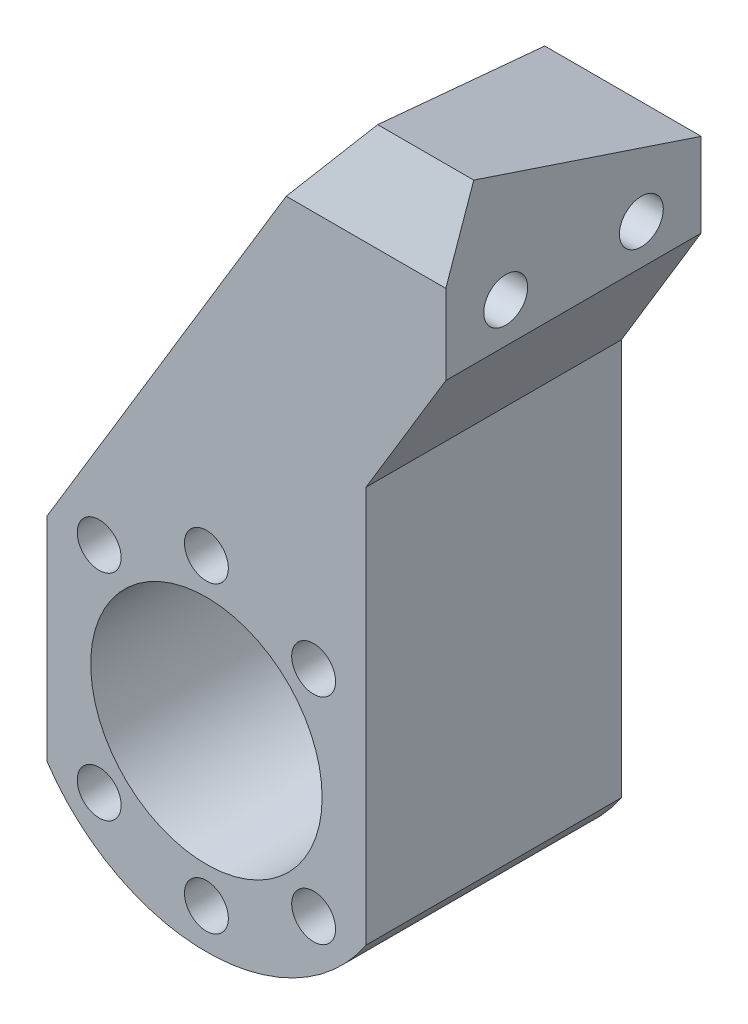
ISO-10303-21;
HEADER;
FILE_DESCRIPTION(('STEP AP214'),'2;1');
FILE_NAME('part.step','',(''),(''),'','','');
FILE_SCHEMA(('AUTOMOTIVE_DESIGN { 1 0 10303 214 1 1 1 1 }'));
ENDSEC;
DATA;
#1=APPLICATION_CONTEXT('core data for automotive mechanical design processes');
#2=APPLICATION_PROTOCOL_DEFINITION('international standard','automotive_design',2000,#1);
#3=PRODUCT_CONTEXT('',#1,'mechanical');
#4=PRODUCT('Part','Part','',(#3));
#5=PRODUCT_RELATED_PRODUCT_CATEGORY('part','',(#4));
#6=PRODUCT_DEFINITION_FORMATION('','',#4);
#7=PRODUCT_DEFINITION_CONTEXT('part definition',#1,'design');
#8=PRODUCT_DEFINITION('design','',#6,#7);
#9=PRODUCT_DEFINITION_SHAPE('','',#8);
#10=(LENGTH_UNIT() NAMED_UNIT(*) SI_UNIT(.MILLI.,.METRE.));
#11=(NAMED_UNIT(*) PLANE_ANGLE_UNIT() SI_UNIT($,.RADIAN.));
#12=(NAMED_UNIT(*) SI_UNIT($,.STERADIAN.) SOLID_ANGLE_UNIT());
#13=UNCERTAINTY_MEASURE_WITH_UNIT(LENGTH_MEASURE(1.E-05),#10,'distance_accuracy_value','');
#14=(GEOMETRIC_REPRESENTATION_CONTEXT(3) GLOBAL_UNCERTAINTY_ASSIGNED_CONTEXT((#13)) GLOBAL_UNIT_ASSIGNED_CONTEXT((#10,
#11,#12)) REPRESENTATION_CONTEXT('',''));
#15=CARTESIAN_POINT('',(0.,0.,0.));
#16=DIRECTION('',(0.,0.,1.));
#17=DIRECTION('',(1.,0.,0.));
#18=AXIS2_PLACEMENT_3D('',#15,#16,#17);
#19=CARTESIAN_POINT('',(0.,0.,32.));
#20=DIRECTION('',(0.,0.,-1.));
#21=DIRECTION('',(-1.,0.,0.));
#22=AXIS2_PLACEMENT_3D('',#19,#20,#21);
#23=PLANE('',#22);
#24=DIRECTION('',(0.,1.,0.));
#25=VECTOR('',#24,1.);
#26=CARTESIAN_POINT('',(20.,13.2664991614216,32.));
#27=LINE('',#26,#25);
#28=CARTESIAN_POINT('',(20.,-13.2664991614216,32.));
#29=VERTEX_POINT('',#28);
#30=CARTESIAN_POINT('',(20.,36.4228304347549,32.));
#31=VERTEX_POINT('',#30);
#32=EDGE_CURVE('E251',#29,#31,#27,.T.);
#33=ORIENTED_EDGE('',*,*,#32,.T.);
#34=DIRECTION('',(0.516511027740023,0.856280537103902,0.));
#35=VECTOR('',#34,1.);
#36=CARTESIAN_POINT('',(20.,36.4228304347549,32.));
#37=LINE('',#36,#35);
#38=CARTESIAN_POINT('',(30.,53.0009960714216,32.));
#39=VERTEX_POINT('',#38);
#40=EDGE_CURVE('E160',#31,#39,#37,.T.);
#41=ORIENTED_EDGE('',*,*,#40,.T.);
#42=DIRECTION('',(0.,1.,0.));
#43=VECTOR('',#42,1.);
#44=CARTESIAN_POINT('',(30.,63.0009960714216,32.));
#45=LINE('',#44,#43);
#46=CARTESIAN_POINT('',(30.,63.0009960714216,32.));
#47=VERTEX_POINT('',#46);
#48=EDGE_CURVE('E163',#39,#47,#45,.T.);
#49=ORIENTED_EDGE('',*,*,#48,.T.);
#50=DIRECTION('',(-1.,0.,0.));
#51=VECTOR('',#50,1.);
#52=CARTESIAN_POINT('',(10.,63.0009960714216,32.));
#53=LINE('',#52,#51);
#54=CARTESIAN_POINT('',(10.,63.0009960714216,32.));
#55=VERTEX_POINT('',#54);
#56=EDGE_CURVE('E152',#47,#55,#53,.T.);
#57=ORIENTED_EDGE('',*,*,#56,.T.);
#58=DIRECTION('',(-0.516511027740022,-0.856280537103901,0.));
#59=VECTOR('',#58,1.);
#60=CARTESIAN_POINT('',(10.,63.0009960714216,32.));
#61=LINE('',#60,#59);
#62=CARTESIAN_POINT('',(-20.,13.2664991614216,32.));
#63=VERTEX_POINT('',#62);
#64=EDGE_CURVE('E162',#55,#63,#61,.T.);
#65=ORIENTED_EDGE('',*,*,#64,.T.);
#66=DIRECTION('',(0.,-1.,0.));
#67=VECTOR('',#66,1.);
#68=CARTESIAN_POINT('',(-20.,13.2664991614216,32.));
#69=LINE('',#68,#67);
#70=CARTESIAN_POINT('',(-20.,-13.2664991614216,32.));
#71=VERTEX_POINT('',#70);
#72=EDGE_CURVE('E254',#63,#71,#69,.T.);
#73=ORIENTED_EDGE('',*,*,#72,.T.);
#74=CARTESIAN_POINT('',(0.,0.,32.));
#75=DIRECTION('',(0.,0.,1.));
#76=DIRECTION('',(1.,0.,0.));
#77=AXIS2_PLACEMENT_3D('',#74,#75,#76);
#78=CIRCLE('',#77,24.);
#79=EDGE_CURVE('E256',#71,#29,#78,.T.);
#80=ORIENTED_EDGE('',*,*,#79,.T.);
#81=EDGE_LOOP('',(#33,#41,#49,#57,#65,#73,#80));
#82=FACE_BOUND('',#81,.T.);
#83=CARTESIAN_POINT('',(0.,0.,32.));
#84=DIRECTION('',(0.,0.,1.));
#85=DIRECTION('',(1.,0.,0.));
#86=AXIS2_PLACEMENT_3D('',#83,#84,#85);
#87=CIRCLE('',#86,14.5);
#88=CARTESIAN_POINT('',(14.5,0.,32.));
#89=VERTEX_POINT('',#88);
#90=EDGE_CURVE('E260',#89,#89,#87,.T.);
#91=ORIENTED_EDGE('',*,*,#90,.F.);
#92=EDGE_LOOP('',(#91));
#93=FACE_BOUND('',#92,.T.);
#94=CARTESIAN_POINT('',(0.,19.,32.));
#95=DIRECTION('',(0.,0.,1.));
#96=DIRECTION('',(1.,0.,0.));
#97=AXIS2_PLACEMENT_3D('',#94,#95,#96);
#98=CIRCLE('',#97,2.75);
#99=CARTESIAN_POINT('',(2.75,19.,32.));
#100=VERTEX_POINT('',#99);
#101=EDGE_CURVE('E266',#100,#100,#98,.T.);
#102=ORIENTED_EDGE('',*,*,#101,.F.);
#103=EDGE_LOOP('',(#102));
#104=FACE_BOUND('',#103,.T.);
#105=CARTESIAN_POINT('',(-13.4350288425444,13.4350288425444,32.));
#106=DIRECTION('',(0.,0.,1.));
#107=DIRECTION('',(1.,0.,0.));
#108=AXIS2_PLACEMENT_3D('',#105,#106,#107);
#109=CIRCLE('',#108,2.75);
#110=CARTESIAN_POINT('',(-10.6850288425444,13.4350288425444,32.));
#111=VERTEX_POINT('',#110);
#112=EDGE_CURVE('E272',#111,#111,#109,.T.);
#113=ORIENTED_EDGE('',*,*,#112,.F.);
#114=EDGE_LOOP('',(#113));
#115=FACE_BOUND('',#114,.T.);
#116=CARTESIAN_POINT('',(13.4350288425444,13.4350288425444,32.));
#117=DIRECTION('',(0.,0.,1.));
#118=DIRECTION('',(1.,0.,0.));
#119=AXIS2_PLACEMENT_3D('',#116,#117,#118);
#120=CIRCLE('',#119,2.75);
#121=CARTESIAN_POINT('',(16.1850288425444,13.4350288425444,32.));
#122=VERTEX_POINT('',#121);
#123=EDGE_CURVE('E278',#122,#122,#120,.T.);
#124=ORIENTED_EDGE('',*,*,#123,.F.);
#125=EDGE_LOOP('',(#124));
#126=FACE_BOUND('',#125,.T.);
#127=CARTESIAN_POINT('',(0.,-19.,32.));
#128=DIRECTION('',(0.,0.,1.));
#129=DIRECTION('',(1.,0.,0.));
#130=AXIS2_PLACEMENT_3D('',#127,#128,#129);
#131=CIRCLE('',#130,2.75);
#132=CARTESIAN_POINT('',(2.75,-19.,32.));
#133=VERTEX_POINT('',#132);
#134=EDGE_CURVE('E284',#133,#133,#131,.T.);
#135=ORIENTED_EDGE('',*,*,#134,.F.);
#136=EDGE_LOOP('',(#135));
#137=FACE_BOUND('',#136,.T.);
#138=CARTESIAN_POINT('',(13.4350288425444,-13.4350288425444,32.));
#139=DIRECTION('',(0.,0.,1.));
#140=DIRECTION('',(1.,0.,0.));
#141=AXIS2_PLACEMENT_3D('',#138,#139,#140);
#142=CIRCLE('',#141,2.75);
#143=CARTESIAN_POINT('',(16.1850288425444,-13.4350288425444,32.));
#144=VERTEX_POINT('',#143);
#145=EDGE_CURVE('E290',#144,#144,#142,.T.);
#146=ORIENTED_EDGE('',*,*,#145,.F.);
#147=EDGE_LOOP('',(#146));
#148=FACE_BOUND('',#147,.T.);
#149=CARTESIAN_POINT('',(-13.4350288425444,-13.4350288425444,32.));
#150=DIRECTION('',(0.,0.,1.));
#151=DIRECTION('',(1.,0.,0.));
#152=AXIS2_PLACEMENT_3D('',#149,#150,#151);
#153=CIRCLE('',#152,2.75);
#154=CARTESIAN_POINT('',(-10.6850288425444,-13.4350288425444,32.));
#155=VERTEX_POINT('',#154);
#156=EDGE_CURVE('E296',#155,#155,#153,.T.);
#157=ORIENTED_EDGE('',*,*,#156,.F.);
#158=EDGE_LOOP('',(#157));
#159=FACE_BOUND('',#158,.T.);
#160=ADVANCED_FACE('F36',(#82,#93,#104,#115,#126,#137,#148,#159),#23,.F.);
#161=CARTESIAN_POINT('',(0.,0.,0.));
#162=DIRECTION('',(0.,0.,-1.));
#163=DIRECTION('',(-1.,0.,0.));
#164=AXIS2_PLACEMENT_3D('',#161,#162,#163);
#165=PLANE('',#164);
#166=DIRECTION('',(-0.622917300632838,-0.782287694248285,0.));
#167=VECTOR('',#166,1.);
#168=CARTESIAN_POINT('',(10.,63.0009960714216,0.));
#169=LINE('',#168,#167);
#170=CARTESIAN_POINT('',(10.3981382458223,63.5009960714216,0.));
#171=VERTEX_POINT('',#170);
#172=CARTESIAN_POINT('',(10.,63.0009960714216,0.));
#173=VERTEX_POINT('',#172);
#174=EDGE_CURVE('E132',#171,#173,#169,.T.);
#175=ORIENTED_EDGE('',*,*,#174,.F.);
#176=DIRECTION('',(1.,0.,0.));
#177=VECTOR('',#176,1.);
#178=CARTESIAN_POINT('',(10.,63.5009960714216,0.));
#179=LINE('',#178,#177);
#180=CARTESIAN_POINT('',(30.,63.5009960714216,0.));
#181=VERTEX_POINT('',#180);
#182=EDGE_CURVE('E174',#171,#181,#179,.T.);
#183=ORIENTED_EDGE('',*,*,#182,.T.);
#184=DIRECTION('',(0.,-1.,0.));
#185=VECTOR('',#184,1.);
#186=CARTESIAN_POINT('',(30.,63.0009960714216,0.));
#187=LINE('',#186,#185);
#188=CARTESIAN_POINT('',(30.,53.0009960714216,0.));
#189=VERTEX_POINT('',#188);
#190=EDGE_CURVE('E138',#181,#189,#187,.T.);
#191=ORIENTED_EDGE('',*,*,#190,.T.);
#192=DIRECTION('',(-0.516511027740022,-0.856280537103901,0.));
#193=VECTOR('',#192,1.);
#194=CARTESIAN_POINT('',(20.,36.4228304347549,0.));
#195=LINE('',#194,#193);
#196=CARTESIAN_POINT('',(20.,36.4228304347549,0.));
#197=VERTEX_POINT('',#196);
#198=EDGE_CURVE('E134',#189,#197,#195,.T.);
#199=ORIENTED_EDGE('',*,*,#198,.T.);
#200=DIRECTION('',(0.,1.,0.));
#201=VECTOR('',#200,1.);
#202=CARTESIAN_POINT('',(20.,13.2664991614216,0.));
#203=LINE('',#202,#201);
#204=CARTESIAN_POINT('',(20.,-13.2664991614216,0.));
#205=VERTEX_POINT('',#204);
#206=EDGE_CURVE('E247',#205,#197,#203,.T.);
#207=ORIENTED_EDGE('',*,*,#206,.F.);
#208=CARTESIAN_POINT('',(0.,0.,0.));
#209=DIRECTION('',(0.,0.,1.));
#210=DIRECTION('',(1.,0.,0.));
#211=AXIS2_PLACEMENT_3D('',#208,#209,#210);
#212=CIRCLE('',#211,24.);
#213=CARTESIAN_POINT('',(-20.,-13.2664991614216,0.));
#214=VERTEX_POINT('',#213);
#215=EDGE_CURVE('E240',#214,#205,#212,.T.);
#216=ORIENTED_EDGE('',*,*,#215,.F.);
#217=DIRECTION('',(0.,-1.,0.));
#218=VECTOR('',#217,1.);
#219=CARTESIAN_POINT('',(-20.,13.2664991614216,0.));
#220=LINE('',#219,#218);
#221=CARTESIAN_POINT('',(-20.,13.2664991614216,0.));
#222=VERTEX_POINT('',#221);
#223=EDGE_CURVE('E248',#222,#214,#220,.T.);
#224=ORIENTED_EDGE('',*,*,#223,.F.);
#225=DIRECTION('',(0.516511027740022,0.856280537103902,0.));
#226=VECTOR('',#225,1.);
#227=CARTESIAN_POINT('',(10.,63.0009960714216,0.));
#228=LINE('',#227,#226);
#229=EDGE_CURVE('E157',#222,#173,#228,.T.);
#230=ORIENTED_EDGE('',*,*,#229,.T.);
#231=EDGE_LOOP('',(#175,#183,#191,#199,#207,#216,#224,#230));
#232=FACE_BOUND('',#231,.T.);
#233=CARTESIAN_POINT('',(13.4350288425444,-13.4350288425444,0.));
#234=DIRECTION('',(0.,0.,1.));
#235=DIRECTION('',(1.,0.,0.));
#236=AXIS2_PLACEMENT_3D('',#233,#234,#235);
#237=CIRCLE('',#236,2.75);
#238=CARTESIAN_POINT('',(16.1850288425444,-13.4350288425444,0.));
#239=VERTEX_POINT('',#238);
#240=EDGE_CURVE('E293',#239,#239,#237,.T.);
#241=ORIENTED_EDGE('',*,*,#240,.T.);
#242=EDGE_LOOP('',(#241));
#243=FACE_BOUND('',#242,.T.);
#244=CARTESIAN_POINT('',(13.4350288425444,13.4350288425444,0.));
#245=DIRECTION('',(0.,0.,1.));
#246=DIRECTION('',(1.,0.,0.));
#247=AXIS2_PLACEMENT_3D('',#244,#245,#246);
#248=CIRCLE('',#247,2.75);
#249=CARTESIAN_POINT('',(16.1850288425444,13.4350288425444,0.));
#250=VERTEX_POINT('',#249);
#251=EDGE_CURVE('E281',#250,#250,#248,.T.);
#252=ORIENTED_EDGE('',*,*,#251,.T.);
#253=EDGE_LOOP('',(#252));
#254=FACE_BOUND('',#253,.T.);
#255=CARTESIAN_POINT('',(0.,19.,0.));
#256=DIRECTION('',(0.,0.,1.));
#257=DIRECTION('',(1.,0.,0.));
#258=AXIS2_PLACEMENT_3D('',#255,#256,#257);
#259=CIRCLE('',#258,2.75);
#260=CARTESIAN_POINT('',(2.75,19.,0.));
#261=VERTEX_POINT('',#260);
#262=EDGE_CURVE('E269',#261,#261,#259,.T.);
#263=ORIENTED_EDGE('',*,*,#262,.T.);
#264=EDGE_LOOP('',(#263));
#265=FACE_BOUND('',#264,.T.);
#266=CARTESIAN_POINT('',(0.,0.,0.));
#267=DIRECTION('',(0.,0.,1.));
#268=DIRECTION('',(1.,0.,0.));
#269=AXIS2_PLACEMENT_3D('',#266,#267,#268);
#270=CIRCLE('',#269,14.5);
#271=CARTESIAN_POINT('',(14.5,0.,0.));
#272=VERTEX_POINT('',#271);
#273=EDGE_CURVE('E263',#272,#272,#270,.T.);
#274=ORIENTED_EDGE('',*,*,#273,.T.);
#275=EDGE_LOOP('',(#274));
#276=FACE_BOUND('',#275,.T.);
#277=CARTESIAN_POINT('',(-13.4350288425444,13.4350288425444,0.));
#278=DIRECTION('',(0.,0.,1.));
#279=DIRECTION('',(1.,0.,0.));
#280=AXIS2_PLACEMENT_3D('',#277,#278,#279);
#281=CIRCLE('',#280,2.75);
#282=CARTESIAN_POINT('',(-10.6850288425444,13.4350288425444,0.));
#283=VERTEX_POINT('',#282);
#284=EDGE_CURVE('E275',#283,#283,#281,.T.);
#285=ORIENTED_EDGE('',*,*,#284,.T.);
#286=EDGE_LOOP('',(#285));
#287=FACE_BOUND('',#286,.T.);
#288=CARTESIAN_POINT('',(0.,-19.,0.));
#289=DIRECTION('',(0.,0.,1.));
#290=DIRECTION('',(1.,0.,0.));
#291=AXIS2_PLACEMENT_3D('',#288,#289,#290);
#292=CIRCLE('',#291,2.75);
#293=CARTESIAN_POINT('',(2.75,-19.,0.));
#294=VERTEX_POINT('',#293);
#295=EDGE_CURVE('E287',#294,#294,#292,.T.);
#296=ORIENTED_EDGE('',*,*,#295,.T.);
#297=EDGE_LOOP('',(#296));
#298=FACE_BOUND('',#297,.T.);
#299=CARTESIAN_POINT('',(-13.4350288425444,-13.4350288425444,0.));
#300=DIRECTION('',(0.,0.,1.));
#301=DIRECTION('',(1.,0.,0.));
#302=AXIS2_PLACEMENT_3D('',#299,#300,#301);
#303=CIRCLE('',#302,2.75);
#304=CARTESIAN_POINT('',(-10.6850288425444,-13.4350288425444,0.));
#305=VERTEX_POINT('',#304);
#306=EDGE_CURVE('E299',#305,#305,#303,.T.);
#307=ORIENTED_EDGE('',*,*,#306,.T.);
#308=EDGE_LOOP('',(#307));
#309=FACE_BOUND('',#308,.T.);
#310=ADVANCED_FACE('F214',(#232,#243,#254,#265,#276,#287,#298,#309),#165,.T.);
#311=CARTESIAN_POINT('',(-20.,13.2664991614216,32.));
#312=DIRECTION('',(1.,0.,0.));
#313=DIRECTION('',(0.,0.,-1.));
#314=AXIS2_PLACEMENT_3D('',#311,#312,#313);
#315=PLANE('',#314);
#316=ORIENTED_EDGE('',*,*,#223,.T.);
#317=DIRECTION('',(0.,0.,-1.));
#318=VECTOR('',#317,1.);
#319=CARTESIAN_POINT('',(-20.,-13.2664991614216,32.));
#320=LINE('',#319,#318);
#321=EDGE_CURVE('E44',#71,#214,#320,.T.);
#322=ORIENTED_EDGE('',*,*,#321,.F.);
#323=ORIENTED_EDGE('',*,*,#72,.F.);
#324=DIRECTION('',(0.,0.,-1.));
#325=VECTOR('',#324,1.);
#326=CARTESIAN_POINT('',(-20.,13.2664991614216,32.));
#327=LINE('',#326,#325);
#328=EDGE_CURVE('E11',#63,#222,#327,.T.);
#329=ORIENTED_EDGE('',*,*,#328,.T.);
#330=EDGE_LOOP('',(#316,#322,#323,#329));
#331=FACE_BOUND('',#330,.T.);
#332=ADVANCED_FACE('F38',(#331),#315,.F.);
#333=CARTESIAN_POINT('',(0.,0.,32.));
#334=DIRECTION('',(0.,0.,-1.));
#335=DIRECTION('',(-1.,0.,0.));
#336=AXIS2_PLACEMENT_3D('',#333,#334,#335);
#337=CYLINDRICAL_SURFACE('',#336,24.);
#338=ORIENTED_EDGE('',*,*,#215,.T.);
#339=DIRECTION('',(0.,0.,-1.));
#340=VECTOR('',#339,1.);
#341=CARTESIAN_POINT('',(20.,-13.2664991614216,32.));
#342=LINE('',#341,#340);
#343=EDGE_CURVE('E243',#29,#205,#342,.T.);
#344=ORIENTED_EDGE('',*,*,#343,.F.);
#345=ORIENTED_EDGE('',*,*,#79,.F.);
#346=ORIENTED_EDGE('',*,*,#321,.T.);
#347=EDGE_LOOP('',(#338,#344,#345,#346));
#348=FACE_BOUND('',#347,.T.);
#349=ADVANCED_FACE('F229',(#348),#337,.T.);
#350=CARTESIAN_POINT('',(20.,13.2664991614216,32.));
#351=DIRECTION('',(-1.,0.,0.));
#352=DIRECTION('',(0.,0.,1.));
#353=AXIS2_PLACEMENT_3D('',#350,#351,#352);
#354=PLANE('',#353);
#355=ORIENTED_EDGE('',*,*,#206,.T.);
#356=DIRECTION('',(0.,0.,-1.));
#357=VECTOR('',#356,1.);
#358=CARTESIAN_POINT('',(20.,36.4228304347549,102.523188972783));
#359=LINE('',#358,#357);
#360=EDGE_CURVE('E145',#31,#197,#359,.T.);
#361=ORIENTED_EDGE('',*,*,#360,.F.);
#362=ORIENTED_EDGE('',*,*,#32,.F.);
#363=ORIENTED_EDGE('',*,*,#343,.T.);
#364=EDGE_LOOP('',(#355,#361,#362,#363));
#365=FACE_BOUND('',#364,.T.);
#366=ADVANCED_FACE('F227',(#365),#354,.F.);
#367=CARTESIAN_POINT('',(0.,0.,32.));
#368=DIRECTION('',(0.,0.,-1.));
#369=DIRECTION('',(-1.,0.,0.));
#370=AXIS2_PLACEMENT_3D('',#367,#368,#369);
#371=CYLINDRICAL_SURFACE('',#370,14.5);
#372=ORIENTED_EDGE('',*,*,#90,.T.);
#373=EDGE_LOOP('',(#372));
#374=FACE_BOUND('',#373,.T.);
#375=ORIENTED_EDGE('',*,*,#273,.F.);
#376=EDGE_LOOP('',(#375));
#377=FACE_BOUND('',#376,.T.);
#378=ADVANCED_FACE('F224',(#374,#377),#371,.F.);
#379=CARTESIAN_POINT('',(0.,19.,32.));
#380=DIRECTION('',(0.,0.,-1.));
#381=DIRECTION('',(-1.,0.,0.));
#382=AXIS2_PLACEMENT_3D('',#379,#380,#381);
#383=CYLINDRICAL_SURFACE('',#382,2.75);
#384=ORIENTED_EDGE('',*,*,#101,.T.);
#385=EDGE_LOOP('',(#384));
#386=FACE_BOUND('',#385,.T.);
#387=ORIENTED_EDGE('',*,*,#262,.F.);
#388=EDGE_LOOP('',(#387));
#389=FACE_BOUND('',#388,.T.);
#390=ADVANCED_FACE('F368',(#386,#389),#383,.F.);
#391=CARTESIAN_POINT('',(-13.4350288425444,13.4350288425444,32.));
#392=DIRECTION('',(0.,0.,-1.));
#393=DIRECTION('',(-1.,0.,0.));
#394=AXIS2_PLACEMENT_3D('',#391,#392,#393);
#395=CYLINDRICAL_SURFACE('',#394,2.75);
#396=ORIENTED_EDGE('',*,*,#112,.T.);
#397=EDGE_LOOP('',(#396));
#398=FACE_BOUND('',#397,.T.);
#399=ORIENTED_EDGE('',*,*,#284,.F.);
#400=EDGE_LOOP('',(#399));
#401=FACE_BOUND('',#400,.T.);
#402=ADVANCED_FACE('F365',(#398,#401),#395,.F.);
#403=CARTESIAN_POINT('',(13.4350288425444,13.4350288425444,32.));
#404=DIRECTION('',(0.,0.,-1.));
#405=DIRECTION('',(-1.,0.,0.));
#406=AXIS2_PLACEMENT_3D('',#403,#404,#405);
#407=CYLINDRICAL_SURFACE('',#406,2.75);
#408=ORIENTED_EDGE('',*,*,#123,.T.);
#409=EDGE_LOOP('',(#408));
#410=FACE_BOUND('',#409,.T.);
#411=ORIENTED_EDGE('',*,*,#251,.F.);
#412=EDGE_LOOP('',(#411));
#413=FACE_BOUND('',#412,.T.);
#414=ADVANCED_FACE('F361',(#410,#413),#407,.F.);
#415=CARTESIAN_POINT('',(0.,-19.,32.));
#416=DIRECTION('',(0.,0.,-1.));
#417=DIRECTION('',(-1.,0.,0.));
#418=AXIS2_PLACEMENT_3D('',#415,#416,#417);
#419=CYLINDRICAL_SURFACE('',#418,2.75);
#420=ORIENTED_EDGE('',*,*,#134,.T.);
#421=EDGE_LOOP('',(#420));
#422=FACE_BOUND('',#421,.T.);
#423=ORIENTED_EDGE('',*,*,#295,.F.);
#424=EDGE_LOOP('',(#423));
#425=FACE_BOUND('',#424,.T.);
#426=ADVANCED_FACE('F357',(#422,#425),#419,.F.);
#427=CARTESIAN_POINT('',(13.4350288425444,-13.4350288425444,32.));
#428=DIRECTION('',(0.,0.,-1.));
#429=DIRECTION('',(-1.,0.,0.));
#430=AXIS2_PLACEMENT_3D('',#427,#428,#429);
#431=CYLINDRICAL_SURFACE('',#430,2.75);
#432=ORIENTED_EDGE('',*,*,#145,.T.);
#433=EDGE_LOOP('',(#432));
#434=FACE_BOUND('',#433,.T.);
#435=ORIENTED_EDGE('',*,*,#240,.F.);
#436=EDGE_LOOP('',(#435));
#437=FACE_BOUND('',#436,.T.);
#438=ADVANCED_FACE('F353',(#434,#437),#431,.F.);
#439=CARTESIAN_POINT('',(-13.4350288425444,-13.4350288425444,32.));
#440=DIRECTION('',(0.,0.,-1.));
#441=DIRECTION('',(-1.,0.,0.));
#442=AXIS2_PLACEMENT_3D('',#439,#440,#441);
#443=CYLINDRICAL_SURFACE('',#442,2.75);
#444=ORIENTED_EDGE('',*,*,#156,.T.);
#445=EDGE_LOOP('',(#444));
#446=FACE_BOUND('',#445,.T.);
#447=ORIENTED_EDGE('',*,*,#306,.F.);
#448=EDGE_LOOP('',(#447));
#449=FACE_BOUND('',#448,.T.);
#450=ADVANCED_FACE('F345',(#446,#449),#443,.F.);
#451=CARTESIAN_POINT('',(20.,36.4228304347549,102.523188972783));
#452=DIRECTION('',(0.856280537103901,-0.516511027740022,0.));
#453=DIRECTION('',(0.516511027740023,0.856280537103902,0.));
#454=AXIS2_PLACEMENT_3D('',#451,#452,#453);
#455=PLANE('',#454);
#456=ORIENTED_EDGE('',*,*,#40,.F.);
#457=ORIENTED_EDGE('',*,*,#360,.T.);
#458=ORIENTED_EDGE('',*,*,#198,.F.);
#459=DIRECTION('',(0.,0.,-1.));
#460=VECTOR('',#459,1.);
#461=CARTESIAN_POINT('',(30.,53.0009960714216,102.523188972783));
#462=LINE('',#461,#460);
#463=EDGE_CURVE('E143',#39,#189,#462,.T.);
#464=ORIENTED_EDGE('',*,*,#463,.F.);
#465=EDGE_LOOP('',(#456,#457,#458,#464));
#466=FACE_BOUND('',#465,.T.);
#467=ADVANCED_FACE('F307',(#466),#455,.T.);
#468=CARTESIAN_POINT('',(30.,63.0009960714216,102.523188972783));
#469=DIRECTION('',(1.,0.,0.));
#470=DIRECTION('',(0.,0.,-1.));
#471=AXIS2_PLACEMENT_3D('',#468,#469,#470);
#472=PLANE('',#471);
#473=CARTESIAN_POINT('',(30.,58.0009960714216,24.5));
#474=DIRECTION('',(1.,0.,0.));
#475=DIRECTION('',(0.,0.,-1.));
#476=AXIS2_PLACEMENT_3D('',#473,#474,#475);
#477=CIRCLE('',#476,2.75);
#478=CARTESIAN_POINT('',(30.,58.0009960714216,21.75));
#479=VERTEX_POINT('',#478);
#480=EDGE_CURVE('E159',#479,#479,#477,.T.);
#481=ORIENTED_EDGE('',*,*,#480,.F.);
#482=EDGE_LOOP('',(#481));
#483=FACE_BOUND('',#482,.T.);
#484=CARTESIAN_POINT('',(30.,58.0009960714216,7.5));
#485=DIRECTION('',(1.,0.,0.));
#486=DIRECTION('',(0.,0.,-1.));
#487=AXIS2_PLACEMENT_3D('',#484,#485,#486);
#488=CIRCLE('',#487,2.75);
#489=CARTESIAN_POINT('',(30.,58.0009960714216,4.75));
#490=VERTEX_POINT('',#489);
#491=EDGE_CURVE('E168',#490,#490,#488,.T.);
#492=ORIENTED_EDGE('',*,*,#491,.F.);
#493=EDGE_LOOP('',(#492));
#494=FACE_BOUND('',#493,.T.);
#495=ORIENTED_EDGE('',*,*,#48,.F.);
#496=ORIENTED_EDGE('',*,*,#463,.T.);
#497=ORIENTED_EDGE('',*,*,#190,.F.);
#498=DIRECTION('',(0.,0.316227766016838,0.948683298050514));
#499=VECTOR('',#498,1.);
#500=CARTESIAN_POINT('',(30.,63.5009960714216,0.));
#501=LINE('',#500,#499);
#502=CARTESIAN_POINT('',(30.,73.0009960714216,28.5));
#503=VERTEX_POINT('',#502);
#504=EDGE_CURVE('E176',#181,#503,#501,.T.);
#505=ORIENTED_EDGE('',*,*,#504,.T.);
#506=DIRECTION('',(0.,-0.943858356366017,0.330350424728106));
#507=VECTOR('',#506,1.);
#508=CARTESIAN_POINT('',(30.,73.0009960714216,28.5));
#509=LINE('',#508,#507);
#510=EDGE_CURVE('E180',#503,#47,#509,.T.);
#511=ORIENTED_EDGE('',*,*,#510,.T.);
#512=EDGE_LOOP('',(#495,#496,#497,#505,#511));
#513=FACE_BOUND('',#512,.T.);
#514=ADVANCED_FACE('F310',(#483,#494,#513),#472,.T.);
#515=CARTESIAN_POINT('',(10.,63.0009960714216,102.523188972783));
#516=DIRECTION('',(-0.856280537103901,0.516511027740022,0.));
#517=DIRECTION('',(-0.516511027740022,-0.856280537103901,0.));
#518=AXIS2_PLACEMENT_3D('',#515,#516,#517);
#519=PLANE('',#518);
#520=CARTESIAN_POINT('',(6.98398477275359,58.0009960714216,7.5));
#521=DIRECTION('',(-0.856280537103901,0.516511027740022,0.));
#522=DIRECTION('',(0.516511027740022,0.856280537103901,0.));
#523=AXIS2_PLACEMENT_3D('',#520,#521,#522);
#524=ELLIPSE('',#523,7.00704937226894,6.);
#525=CARTESIAN_POINT('',(10.,63.0009960714216,10.8166247903555));
#526=VERTEX_POINT('',#525);
#527=CARTESIAN_POINT('',(10.,63.0009960714216,4.18337520964467));
#528=VERTEX_POINT('',#527);
#529=EDGE_CURVE('E50',#526,#528,#524,.F.);
#530=ORIENTED_EDGE('',*,*,#529,.T.);
#531=DIRECTION('',(0.,0.,-1.));
#532=VECTOR('',#531,1.);
#533=CARTESIAN_POINT('',(10.,63.0009960714216,102.523188972783));
#534=LINE('',#533,#532);
#535=EDGE_CURVE('E125',#528,#173,#534,.T.);
#536=ORIENTED_EDGE('',*,*,#535,.T.);
#537=ORIENTED_EDGE('',*,*,#229,.F.);
#538=ORIENTED_EDGE('',*,*,#328,.F.);
#539=ORIENTED_EDGE('',*,*,#64,.F.);
#540=CARTESIAN_POINT('',(10.,63.0009960714216,27.8166247903554));
#541=VERTEX_POINT('',#540);
#542=EDGE_CURVE('E136',#55,#541,#534,.T.);
#543=ORIENTED_EDGE('',*,*,#542,.T.);
#544=CARTESIAN_POINT('',(6.98398477275359,58.0009960714216,24.5));
#545=DIRECTION('',(-0.856280537103901,0.516511027740022,0.));
#546=DIRECTION('',(0.516511027740022,0.856280537103901,0.));
#547=AXIS2_PLACEMENT_3D('',#544,#545,#546);
#548=ELLIPSE('',#547,7.00704937226894,6.);
#549=CARTESIAN_POINT('',(10.,63.0009960714216,21.1833752096447));
#550=VERTEX_POINT('',#549);
#551=EDGE_CURVE('E57',#541,#550,#548,.F.);
#552=ORIENTED_EDGE('',*,*,#551,.T.);
#553=EDGE_CURVE('E127',#550,#526,#534,.T.);
#554=ORIENTED_EDGE('',*,*,#553,.T.);
#555=EDGE_LOOP('',(#530,#536,#537,#538,#539,#543,#552,#554));
#556=FACE_BOUND('',#555,.T.);
#557=ADVANCED_FACE('F123',(#556),#519,.T.);
#558=CARTESIAN_POINT('',(-20.001,58.0009960714216,7.5));
#559=DIRECTION('',(1.,0.,0.));
#560=DIRECTION('',(0.,0.,-1.));
#561=AXIS2_PLACEMENT_3D('',#558,#559,#560);
#562=CYLINDRICAL_SURFACE('',#561,2.75);
#563=CARTESIAN_POINT('',(20.,58.0009960714216,7.5));
#564=DIRECTION('',(1.,0.,0.));
#565=DIRECTION('',(0.,0.,-1.));
#566=AXIS2_PLACEMENT_3D('',#563,#564,#565);
#567=CIRCLE('',#566,2.75);
#568=CARTESIAN_POINT('',(20.,58.0009960714216,4.75));
#569=VERTEX_POINT('',#568);
#570=EDGE_CURVE('E120',#569,#569,#567,.T.);
#571=ORIENTED_EDGE('',*,*,#570,.F.);
#572=EDGE_LOOP('',(#571));
#573=FACE_BOUND('',#572,.T.);
#574=ORIENTED_EDGE('',*,*,#491,.T.);
#575=EDGE_LOOP('',(#574));
#576=FACE_BOUND('',#575,.T.);
#577=ADVANCED_FACE('F338',(#573,#576),#562,.F.);
#578=CARTESIAN_POINT('',(-20.001,58.0009960714216,24.5));
#579=DIRECTION('',(1.,0.,0.));
#580=DIRECTION('',(0.,0.,-1.));
#581=AXIS2_PLACEMENT_3D('',#578,#579,#580);
#582=CYLINDRICAL_SURFACE('',#581,2.75);
#583=CARTESIAN_POINT('',(20.,58.0009960714216,24.5));
#584=DIRECTION('',(1.,0.,0.));
#585=DIRECTION('',(0.,0.,-1.));
#586=AXIS2_PLACEMENT_3D('',#583,#584,#585);
#587=CIRCLE('',#586,2.75);
#588=CARTESIAN_POINT('',(20.,58.0009960714216,21.75));
#589=VERTEX_POINT('',#588);
#590=EDGE_CURVE('E193',#589,#589,#587,.T.);
#591=ORIENTED_EDGE('',*,*,#590,.F.);
#592=EDGE_LOOP('',(#591));
#593=FACE_BOUND('',#592,.T.);
#594=ORIENTED_EDGE('',*,*,#480,.T.);
#595=EDGE_LOOP('',(#594));
#596=FACE_BOUND('',#595,.T.);
#597=ADVANCED_FACE('F335',(#593,#596),#582,.F.);
#598=CARTESIAN_POINT('',(10.,73.0009960714216,28.5));
#599=DIRECTION('',(0.,0.330350424728106,0.943858356366017));
#600=DIRECTION('',(0.,-0.943858356366017,0.330350424728106));
#601=AXIS2_PLACEMENT_3D('',#598,#599,#600);
#602=PLANE('',#601);
#603=DIRECTION('',(-0.600804066232422,-0.754516895245112,0.264080913335789));
#604=VECTOR('',#603,1.);
#605=CARTESIAN_POINT('',(9.99984133911346,63.0007968179108,32.0000697387288));
#606=LINE('',#605,#604);
#607=CARTESIAN_POINT('',(17.9627649164469,73.0009960714216,28.5));
#608=VERTEX_POINT('',#607);
#609=EDGE_CURVE('E184',#608,#55,#606,.T.);
#610=ORIENTED_EDGE('',*,*,#609,.T.);
#611=ORIENTED_EDGE('',*,*,#56,.F.);
#612=ORIENTED_EDGE('',*,*,#510,.F.);
#613=DIRECTION('',(1.,0.,0.));
#614=VECTOR('',#613,1.);
#615=CARTESIAN_POINT('',(10.,73.0009960714216,28.5));
#616=LINE('',#615,#614);
#617=EDGE_CURVE('E171',#608,#503,#616,.T.);
#618=ORIENTED_EDGE('',*,*,#617,.F.);
#619=EDGE_LOOP('',(#610,#611,#612,#618));
#620=FACE_BOUND('',#619,.T.);
#621=ADVANCED_FACE('F316',(#620),#602,.T.);
#622=CARTESIAN_POINT('',(10.,63.5009960714216,0.));
#623=DIRECTION('',(0.,0.948683298050514,-0.316227766016838));
#624=DIRECTION('',(0.,0.316227766016838,0.948683298050514));
#625=AXIS2_PLACEMENT_3D('',#622,#623,#624);
#626=PLANE('',#625);
#627=DIRECTION('',(0.244182433558142,0.306655334070944,0.919966002212833));
#628=VECTOR('',#627,1.);
#629=CARTESIAN_POINT('',(17.5256491361086,72.4520463222767,26.8531507525652));
#630=LINE('',#629,#628);
#631=EDGE_CURVE('E128',#171,#608,#630,.T.);
#632=ORIENTED_EDGE('',*,*,#631,.T.);
#633=ORIENTED_EDGE('',*,*,#617,.T.);
#634=ORIENTED_EDGE('',*,*,#504,.F.);
#635=ORIENTED_EDGE('',*,*,#182,.F.);
#636=EDGE_LOOP('',(#632,#633,#634,#635));
#637=FACE_BOUND('',#636,.T.);
#638=ADVANCED_FACE('F312',(#637),#626,.T.);
#639=CARTESIAN_POINT('',(10.,63.0009960714216,32.001));
#640=DIRECTION('',(0.782287694248285,-0.622917300632838,0.));
#641=DIRECTION('',(0.622917300632838,0.782287694248285,0.));
#642=AXIS2_PLACEMENT_3D('',#639,#640,#641);
#643=PLANE('',#642);
#644=ORIENTED_EDGE('',*,*,#535,.F.);
#645=CARTESIAN_POINT('',(6.01861754177656,58.0009960714216,7.5));
#646=DIRECTION('',(0.782287694248285,-0.622917300632838,0.));
#647=DIRECTION('',(0.622917300632838,0.782287694248285,0.));
#648=AXIS2_PLACEMENT_3D('',#645,#646,#647);
#649=ELLIPSE('',#648,7.6698125818859,6.);
#650=EDGE_CURVE('E113',#526,#528,#649,.F.);
#651=ORIENTED_EDGE('',*,*,#650,.F.);
#652=ORIENTED_EDGE('',*,*,#553,.F.);
#653=CARTESIAN_POINT('',(6.01861754177656,58.0009960714216,24.5));
#654=DIRECTION('',(0.782287694248285,-0.622917300632838,0.));
#655=DIRECTION('',(0.622917300632838,0.782287694248285,0.));
#656=AXIS2_PLACEMENT_3D('',#653,#654,#655);
#657=ELLIPSE('',#656,7.66981258188589,6.);
#658=EDGE_CURVE('E191',#541,#550,#657,.F.);
#659=ORIENTED_EDGE('',*,*,#658,.F.);
#660=ORIENTED_EDGE('',*,*,#542,.F.);
#661=ORIENTED_EDGE('',*,*,#609,.F.);
#662=ORIENTED_EDGE('',*,*,#631,.F.);
#663=ORIENTED_EDGE('',*,*,#174,.T.);
#664=EDGE_LOOP('',(#644,#651,#652,#659,#660,#661,#662,#663));
#665=FACE_BOUND('',#664,.T.);
#666=ADVANCED_FACE('F130',(#665),#643,.F.);
#667=CARTESIAN_POINT('',(-20.001,58.0009960714216,24.5));
#668=DIRECTION('',(1.,0.,0.));
#669=DIRECTION('',(0.,0.,-1.));
#670=AXIS2_PLACEMENT_3D('',#667,#668,#669);
#671=CYLINDRICAL_SURFACE('',#670,6.);
#672=ORIENTED_EDGE('',*,*,#658,.T.);
#673=ORIENTED_EDGE('',*,*,#551,.F.);
#674=EDGE_LOOP('',(#672,#673));
#675=FACE_BOUND('',#674,.T.);
#676=CARTESIAN_POINT('',(20.,58.0009960714216,24.5));
#677=DIRECTION('',(1.,0.,0.));
#678=DIRECTION('',(0.,0.,-1.));
#679=AXIS2_PLACEMENT_3D('',#676,#677,#678);
#680=CIRCLE('',#679,6.);
#681=CARTESIAN_POINT('',(20.,58.0009960714216,18.5));
#682=VERTEX_POINT('',#681);
#683=EDGE_CURVE('E196',#682,#682,#680,.T.);
#684=ORIENTED_EDGE('',*,*,#683,.T.);
#685=EDGE_LOOP('',(#684));
#686=FACE_BOUND('',#685,.T.);
#687=ADVANCED_FACE('F317',(#675,#686),#671,.F.);
#688=CARTESIAN_POINT('',(20.,58.0009960714216,24.5));
#689=DIRECTION('',(1.,0.,0.));
#690=DIRECTION('',(0.,0.,-1.));
#691=AXIS2_PLACEMENT_3D('',#688,#689,#690);
#692=PLANE('',#691);
#693=ORIENTED_EDGE('',*,*,#590,.T.);
#694=EDGE_LOOP('',(#693));
#695=FACE_BOUND('',#694,.T.);
#696=ORIENTED_EDGE('',*,*,#683,.F.);
#697=EDGE_LOOP('',(#696));
#698=FACE_BOUND('',#697,.T.);
#699=ADVANCED_FACE('F211',(#695,#698),#692,.F.);
#700=CARTESIAN_POINT('',(-20.001,58.0009960714216,7.5));
#701=DIRECTION('',(1.,0.,0.));
#702=DIRECTION('',(0.,0.,-1.));
#703=AXIS2_PLACEMENT_3D('',#700,#701,#702);
#704=CYLINDRICAL_SURFACE('',#703,6.);
#705=ORIENTED_EDGE('',*,*,#650,.T.);
#706=ORIENTED_EDGE('',*,*,#529,.F.);
#707=EDGE_LOOP('',(#705,#706));
#708=FACE_BOUND('',#707,.T.);
#709=CARTESIAN_POINT('',(20.,58.0009960714216,7.5));
#710=DIRECTION('',(1.,0.,0.));
#711=DIRECTION('',(0.,0.,-1.));
#712=AXIS2_PLACEMENT_3D('',#709,#710,#711);
#713=CIRCLE('',#712,6.);
#714=CARTESIAN_POINT('',(20.,58.0009960714216,1.5));
#715=VERTEX_POINT('',#714);
#716=EDGE_CURVE('E190',#715,#715,#713,.T.);
#717=ORIENTED_EDGE('',*,*,#716,.T.);
#718=EDGE_LOOP('',(#717));
#719=FACE_BOUND('',#718,.T.);
#720=ADVANCED_FACE('F114',(#708,#719),#704,.F.);
#721=CARTESIAN_POINT('',(20.,58.0009960714216,7.5));
#722=DIRECTION('',(1.,0.,0.));
#723=DIRECTION('',(0.,0.,-1.));
#724=AXIS2_PLACEMENT_3D('',#721,#722,#723);
#725=PLANE('',#724);
#726=ORIENTED_EDGE('',*,*,#570,.T.);
#727=EDGE_LOOP('',(#726));
#728=FACE_BOUND('',#727,.T.);
#729=ORIENTED_EDGE('',*,*,#716,.F.);
#730=EDGE_LOOP('',(#729));
#731=FACE_BOUND('',#730,.T.);
#732=ADVANCED_FACE('F204',(#728,#731),#725,.F.);
#733=CLOSED_SHELL('',(#160,#310,#332,#349,#366,#378,#390,#402,#414,#426,#438,#450,#467,#514,
#557,#577,#597,#621,#638,#666,#687,#699,#720,#732));
#734=MANIFOLD_SOLID_BREP('B2',#733);
#735=ADVANCED_BREP_SHAPE_REPRESENTATION('',(#18,#734),#14);
#736=SHAPE_DEFINITION_REPRESENTATION(#9,#735);
ENDSEC;
END-ISO-10303-21;
